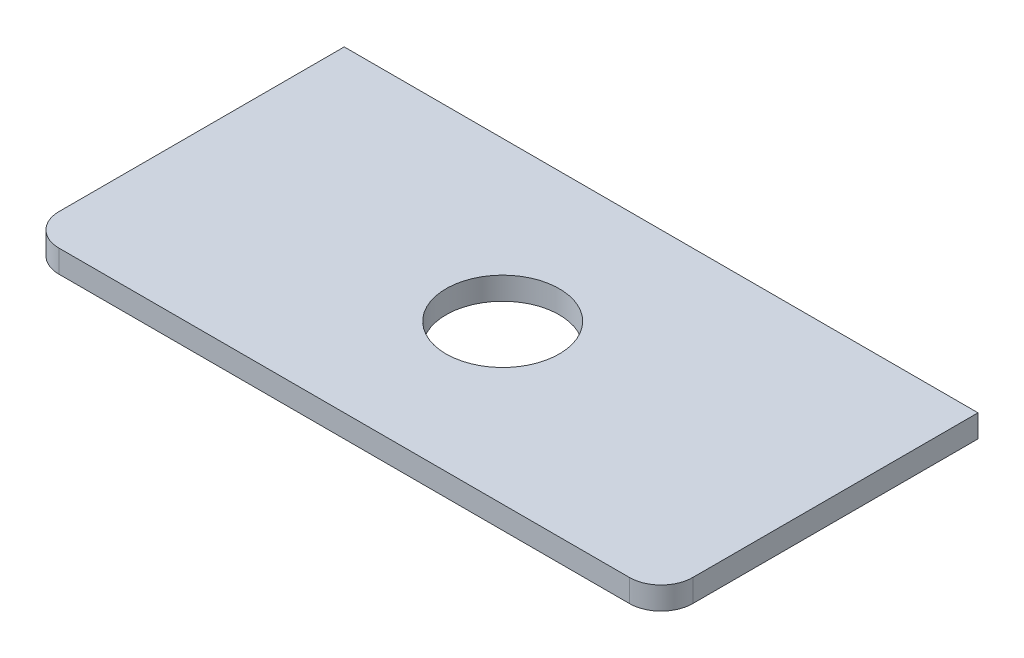
ISO-10303-21;
HEADER;
FILE_DESCRIPTION(('STEP AP214'),'2;1');
FILE_NAME('part.step','',(''),(''),'','','');
FILE_SCHEMA(('AUTOMOTIVE_DESIGN { 1 0 10303 214 1 1 1 1 }'));
ENDSEC;
DATA;
#1=APPLICATION_CONTEXT('core data for automotive mechanical design processes');
#2=APPLICATION_PROTOCOL_DEFINITION('international standard','automotive_design',2000,#1);
#3=PRODUCT_CONTEXT('',#1,'mechanical');
#4=PRODUCT('Part','Part','',(#3));
#5=PRODUCT_RELATED_PRODUCT_CATEGORY('part','',(#4));
#6=PRODUCT_DEFINITION_FORMATION('','',#4);
#7=PRODUCT_DEFINITION_CONTEXT('part definition',#1,'design');
#8=PRODUCT_DEFINITION('design','',#6,#7);
#9=PRODUCT_DEFINITION_SHAPE('','',#8);
#10=(LENGTH_UNIT() NAMED_UNIT(*) SI_UNIT(.MILLI.,.METRE.));
#11=(NAMED_UNIT(*) PLANE_ANGLE_UNIT() SI_UNIT($,.RADIAN.));
#12=(NAMED_UNIT(*) SI_UNIT($,.STERADIAN.) SOLID_ANGLE_UNIT());
#13=UNCERTAINTY_MEASURE_WITH_UNIT(LENGTH_MEASURE(1.E-05),#10,'distance_accuracy_value','');
#14=(GEOMETRIC_REPRESENTATION_CONTEXT(3) GLOBAL_UNCERTAINTY_ASSIGNED_CONTEXT((#13)) GLOBAL_UNIT_ASSIGNED_CONTEXT((#10,
#11,#12)) REPRESENTATION_CONTEXT('',''));
#15=CARTESIAN_POINT('',(0.,0.,0.));
#16=DIRECTION('',(0.,0.,1.));
#17=DIRECTION('',(1.,0.,0.));
#18=AXIS2_PLACEMENT_3D('',#15,#16,#17);
#19=CARTESIAN_POINT('',(140.,10.,70.));
#20=DIRECTION('',(-1.,0.,0.));
#21=DIRECTION('',(0.,0.,1.));
#22=AXIS2_PLACEMENT_3D('',#19,#20,#21);
#23=PLANE('',#22);
#24=DIRECTION('',(0.,0.,-1.));
#25=VECTOR('',#24,1.);
#26=CARTESIAN_POINT('',(140.,10.,70.));
#27=LINE('',#26,#25);
#28=CARTESIAN_POINT('',(140.,10.,56.));
#29=VERTEX_POINT('',#28);
#30=CARTESIAN_POINT('',(140.,10.,-70.));
#31=VERTEX_POINT('',#30);
#32=EDGE_CURVE('E89',#29,#31,#27,.T.);
#33=ORIENTED_EDGE('',*,*,#32,.F.);
#34=DIRECTION('',(0.,-1.,0.));
#35=VECTOR('',#34,1.);
#36=CARTESIAN_POINT('',(140.,10.,56.));
#37=LINE('',#36,#35);
#38=CARTESIAN_POINT('',(140.,0.,56.));
#39=VERTEX_POINT('',#38);
#40=EDGE_CURVE('E112',#29,#39,#37,.T.);
#41=ORIENTED_EDGE('',*,*,#40,.T.);
#42=DIRECTION('',(0.,0.,-1.));
#43=VECTOR('',#42,1.);
#44=CARTESIAN_POINT('',(140.,0.,70.));
#45=LINE('',#44,#43);
#46=CARTESIAN_POINT('',(140.,0.,-70.));
#47=VERTEX_POINT('',#46);
#48=EDGE_CURVE('E110',#39,#47,#45,.T.);
#49=ORIENTED_EDGE('',*,*,#48,.T.);
#50=DIRECTION('',(0.,-1.,0.));
#51=VECTOR('',#50,1.);
#52=CARTESIAN_POINT('',(140.,10.,-70.));
#53=LINE('',#52,#51);
#54=EDGE_CURVE('E104',#31,#47,#53,.T.);
#55=ORIENTED_EDGE('',*,*,#54,.F.);
#56=EDGE_LOOP('',(#33,#41,#49,#55));
#57=FACE_BOUND('',#56,.T.);
#58=ADVANCED_FACE('F35',(#57),#23,.F.);
#59=CARTESIAN_POINT('',(-140.,10.,-70.));
#60=DIRECTION('',(0.,0.,1.));
#61=DIRECTION('',(1.,0.,0.));
#62=AXIS2_PLACEMENT_3D('',#59,#60,#61);
#63=PLANE('',#62);
#64=DIRECTION('',(-1.,0.,0.));
#65=VECTOR('',#64,1.);
#66=CARTESIAN_POINT('',(-140.,0.,-70.));
#67=LINE('',#66,#65);
#68=CARTESIAN_POINT('',(-140.,0.,-70.));
#69=VERTEX_POINT('',#68);
#70=EDGE_CURVE('E139',#47,#69,#67,.T.);
#71=ORIENTED_EDGE('',*,*,#70,.T.);
#72=DIRECTION('',(0.,-1.,0.));
#73=VECTOR('',#72,1.);
#74=CARTESIAN_POINT('',(-140.,10.,-70.));
#75=LINE('',#74,#73);
#76=CARTESIAN_POINT('',(-140.,10.,-70.));
#77=VERTEX_POINT('',#76);
#78=EDGE_CURVE('E106',#77,#69,#75,.T.);
#79=ORIENTED_EDGE('',*,*,#78,.F.);
#80=DIRECTION('',(-1.,0.,0.));
#81=VECTOR('',#80,1.);
#82=CARTESIAN_POINT('',(-140.,10.,-70.));
#83=LINE('',#82,#81);
#84=EDGE_CURVE('E92',#31,#77,#83,.T.);
#85=ORIENTED_EDGE('',*,*,#84,.F.);
#86=ORIENTED_EDGE('',*,*,#54,.T.);
#87=EDGE_LOOP('',(#71,#79,#85,#86));
#88=FACE_BOUND('',#87,.T.);
#89=ADVANCED_FACE('F103',(#88),#63,.F.);
#90=CARTESIAN_POINT('',(-140.,10.,70.));
#91=DIRECTION('',(1.,0.,0.));
#92=DIRECTION('',(0.,0.,-1.));
#93=AXIS2_PLACEMENT_3D('',#90,#91,#92);
#94=PLANE('',#93);
#95=DIRECTION('',(0.,0.,1.));
#96=VECTOR('',#95,1.);
#97=CARTESIAN_POINT('',(-140.,0.,70.));
#98=LINE('',#97,#96);
#99=CARTESIAN_POINT('',(-140.,0.,56.));
#100=VERTEX_POINT('',#99);
#101=EDGE_CURVE('E137',#69,#100,#98,.T.);
#102=ORIENTED_EDGE('',*,*,#101,.T.);
#103=DIRECTION('',(0.,-1.,0.));
#104=VECTOR('',#103,1.);
#105=CARTESIAN_POINT('',(-140.,10.,56.));
#106=LINE('',#105,#104);
#107=CARTESIAN_POINT('',(-140.,10.,56.));
#108=VERTEX_POINT('',#107);
#109=EDGE_CURVE('E11',#100,#108,#106,.F.);
#110=ORIENTED_EDGE('',*,*,#109,.T.);
#111=DIRECTION('',(0.,0.,1.));
#112=VECTOR('',#111,1.);
#113=CARTESIAN_POINT('',(-140.,10.,70.));
#114=LINE('',#113,#112);
#115=EDGE_CURVE('E107',#77,#108,#114,.T.);
#116=ORIENTED_EDGE('',*,*,#115,.F.);
#117=ORIENTED_EDGE('',*,*,#78,.T.);
#118=EDGE_LOOP('',(#102,#110,#116,#117));
#119=FACE_BOUND('',#118,.T.);
#120=ADVANCED_FACE('F138',(#119),#94,.F.);
#121=CARTESIAN_POINT('',(-140.,10.,70.));
#122=DIRECTION('',(0.,0.,-1.));
#123=DIRECTION('',(-1.,0.,0.));
#124=AXIS2_PLACEMENT_3D('',#121,#122,#123);
#125=PLANE('',#124);
#126=DIRECTION('',(1.,0.,0.));
#127=VECTOR('',#126,1.);
#128=CARTESIAN_POINT('',(-140.,0.,70.));
#129=LINE('',#128,#127);
#130=CARTESIAN_POINT('',(-126.,0.,70.));
#131=VERTEX_POINT('',#130);
#132=CARTESIAN_POINT('',(126.,0.,70.));
#133=VERTEX_POINT('',#132);
#134=EDGE_CURVE('E99',#131,#133,#129,.T.);
#135=ORIENTED_EDGE('',*,*,#134,.T.);
#136=DIRECTION('',(0.,-1.,0.));
#137=VECTOR('',#136,1.);
#138=CARTESIAN_POINT('',(126.,10.,70.));
#139=LINE('',#138,#137);
#140=CARTESIAN_POINT('',(126.,10.,70.));
#141=VERTEX_POINT('',#140);
#142=EDGE_CURVE('E56',#133,#141,#139,.F.);
#143=ORIENTED_EDGE('',*,*,#142,.T.);
#144=DIRECTION('',(1.,0.,0.));
#145=VECTOR('',#144,1.);
#146=CARTESIAN_POINT('',(-140.,10.,70.));
#147=LINE('',#146,#145);
#148=CARTESIAN_POINT('',(-126.,10.,70.));
#149=VERTEX_POINT('',#148);
#150=EDGE_CURVE('E116',#149,#141,#147,.T.);
#151=ORIENTED_EDGE('',*,*,#150,.F.);
#152=DIRECTION('',(0.,-1.,0.));
#153=VECTOR('',#152,1.);
#154=CARTESIAN_POINT('',(-126.,10.,70.));
#155=LINE('',#154,#153);
#156=EDGE_CURVE('E123',#149,#131,#155,.T.);
#157=ORIENTED_EDGE('',*,*,#156,.T.);
#158=EDGE_LOOP('',(#135,#143,#151,#157));
#159=FACE_BOUND('',#158,.T.);
#160=ADVANCED_FACE('F131',(#159),#125,.F.);
#161=CARTESIAN_POINT('',(0.,10.,0.));
#162=DIRECTION('',(0.,-1.,0.));
#163=DIRECTION('',(0.,0.,-1.));
#164=AXIS2_PLACEMENT_3D('',#161,#162,#163);
#165=PLANE('',#164);
#166=CARTESIAN_POINT('',(0.,10.,0.));
#167=DIRECTION('',(0.,1.,0.));
#168=DIRECTION('',(0.,0.,1.));
#169=AXIS2_PLACEMENT_3D('',#166,#167,#168);
#170=CIRCLE('',#169,25.);
#171=CARTESIAN_POINT('',(0.,10.,25.));
#172=VERTEX_POINT('',#171);
#173=EDGE_CURVE('E146',#172,#172,#170,.T.);
#174=ORIENTED_EDGE('',*,*,#173,.F.);
#175=EDGE_LOOP('',(#174));
#176=FACE_BOUND('',#175,.T.);
#177=ORIENTED_EDGE('',*,*,#150,.T.);
#178=CARTESIAN_POINT('',(126.,10.,56.));
#179=DIRECTION('',(0.,-1.,0.));
#180=DIRECTION('',(0.,0.,-1.));
#181=AXIS2_PLACEMENT_3D('',#178,#179,#180);
#182=CIRCLE('',#181,14.);
#183=EDGE_CURVE('E43',#141,#29,#182,.F.);
#184=ORIENTED_EDGE('',*,*,#183,.T.);
#185=ORIENTED_EDGE('',*,*,#32,.T.);
#186=ORIENTED_EDGE('',*,*,#84,.T.);
#187=ORIENTED_EDGE('',*,*,#115,.T.);
#188=CARTESIAN_POINT('',(-126.,10.,56.));
#189=DIRECTION('',(0.,-1.,0.));
#190=DIRECTION('',(0.,0.,-1.));
#191=AXIS2_PLACEMENT_3D('',#188,#189,#190);
#192=CIRCLE('',#191,14.);
#193=EDGE_CURVE('E127',#108,#149,#192,.F.);
#194=ORIENTED_EDGE('',*,*,#193,.T.);
#195=EDGE_LOOP('',(#177,#184,#185,#186,#187,#194));
#196=FACE_BOUND('',#195,.T.);
#197=ADVANCED_FACE('F91',(#176,#196),#165,.F.);
#198=CARTESIAN_POINT('',(0.,0.,0.));
#199=DIRECTION('',(0.,-1.,0.));
#200=DIRECTION('',(0.,0.,-1.));
#201=AXIS2_PLACEMENT_3D('',#198,#199,#200);
#202=PLANE('',#201);
#203=CARTESIAN_POINT('',(0.,0.,0.));
#204=DIRECTION('',(0.,1.,0.));
#205=DIRECTION('',(0.,0.,1.));
#206=AXIS2_PLACEMENT_3D('',#203,#204,#205);
#207=CIRCLE('',#206,25.);
#208=CARTESIAN_POINT('',(0.,0.,25.));
#209=VERTEX_POINT('',#208);
#210=EDGE_CURVE('E143',#209,#209,#207,.T.);
#211=ORIENTED_EDGE('',*,*,#210,.T.);
#212=EDGE_LOOP('',(#211));
#213=FACE_BOUND('',#212,.T.);
#214=ORIENTED_EDGE('',*,*,#48,.F.);
#215=CARTESIAN_POINT('',(126.,0.,56.));
#216=DIRECTION('',(0.,-1.,0.));
#217=DIRECTION('',(0.,0.,-1.));
#218=AXIS2_PLACEMENT_3D('',#215,#216,#217);
#219=CIRCLE('',#218,14.);
#220=EDGE_CURVE('E121',#39,#133,#219,.T.);
#221=ORIENTED_EDGE('',*,*,#220,.T.);
#222=ORIENTED_EDGE('',*,*,#134,.F.);
#223=CARTESIAN_POINT('',(-126.,0.,56.));
#224=DIRECTION('',(0.,-1.,0.));
#225=DIRECTION('',(0.,0.,-1.));
#226=AXIS2_PLACEMENT_3D('',#223,#224,#225);
#227=CIRCLE('',#226,14.);
#228=EDGE_CURVE('E114',#131,#100,#227,.T.);
#229=ORIENTED_EDGE('',*,*,#228,.T.);
#230=ORIENTED_EDGE('',*,*,#101,.F.);
#231=ORIENTED_EDGE('',*,*,#70,.F.);
#232=EDGE_LOOP('',(#214,#221,#222,#229,#230,#231));
#233=FACE_BOUND('',#232,.T.);
#234=ADVANCED_FACE('F136',(#213,#233),#202,.T.);
#235=CARTESIAN_POINT('',(126.,10.,56.));
#236=DIRECTION('',(0.,-1.,0.));
#237=DIRECTION('',(0.,0.,-1.));
#238=AXIS2_PLACEMENT_3D('',#235,#236,#237);
#239=CYLINDRICAL_SURFACE('',#238,14.);
#240=ORIENTED_EDGE('',*,*,#183,.F.);
#241=ORIENTED_EDGE('',*,*,#142,.F.);
#242=ORIENTED_EDGE('',*,*,#220,.F.);
#243=ORIENTED_EDGE('',*,*,#40,.F.);
#244=EDGE_LOOP('',(#240,#241,#242,#243));
#245=FACE_BOUND('',#244,.T.);
#246=ADVANCED_FACE('F165',(#245),#239,.T.);
#247=CARTESIAN_POINT('',(-126.,10.,56.));
#248=DIRECTION('',(0.,-1.,0.));
#249=DIRECTION('',(0.,0.,-1.));
#250=AXIS2_PLACEMENT_3D('',#247,#248,#249);
#251=CYLINDRICAL_SURFACE('',#250,14.);
#252=ORIENTED_EDGE('',*,*,#193,.F.);
#253=ORIENTED_EDGE('',*,*,#109,.F.);
#254=ORIENTED_EDGE('',*,*,#228,.F.);
#255=ORIENTED_EDGE('',*,*,#156,.F.);
#256=EDGE_LOOP('',(#252,#253,#254,#255));
#257=FACE_BOUND('',#256,.T.);
#258=ADVANCED_FACE('F37',(#257),#251,.T.);
#259=CARTESIAN_POINT('',(0.,0.,0.));
#260=DIRECTION('',(0.,1.,0.));
#261=DIRECTION('',(0.,0.,1.));
#262=AXIS2_PLACEMENT_3D('',#259,#260,#261);
#263=CYLINDRICAL_SURFACE('',#262,25.);
#264=ORIENTED_EDGE('',*,*,#210,.F.);
#265=EDGE_LOOP('',(#264));
#266=FACE_BOUND('',#265,.T.);
#267=ORIENTED_EDGE('',*,*,#173,.T.);
#268=EDGE_LOOP('',(#267));
#269=FACE_BOUND('',#268,.T.);
#270=ADVANCED_FACE('F153',(#266,#269),#263,.F.);
#271=CLOSED_SHELL('',(#58,#89,#120,#160,#197,#234,#246,#258,#270));
#272=MANIFOLD_SOLID_BREP('B2',#271);
#273=ADVANCED_BREP_SHAPE_REPRESENTATION('',(#18,#272),#14);
#274=SHAPE_DEFINITION_REPRESENTATION(#9,#273);
ENDSEC;
END-ISO-10303-21;
